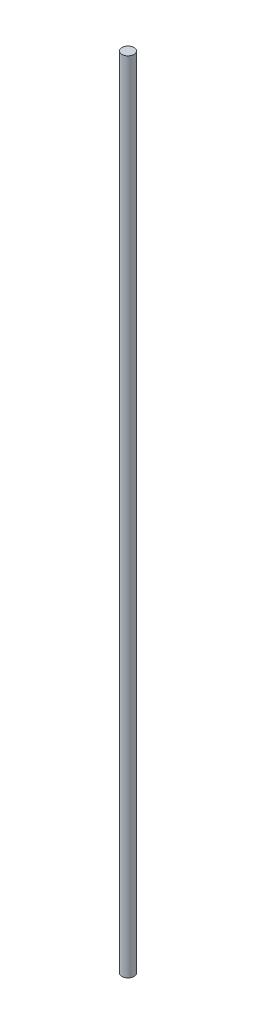
ISO-10303-21;
HEADER;
FILE_DESCRIPTION(('STEP AP214'),'2;1');
FILE_NAME('part.step','',(''),(''),'','','');
FILE_SCHEMA(('AUTOMOTIVE_DESIGN { 1 0 10303 214 1 1 1 1 }'));
ENDSEC;
DATA;
#1=APPLICATION_CONTEXT('core data for automotive mechanical design processes');
#2=APPLICATION_PROTOCOL_DEFINITION('international standard','automotive_design',2000,#1);
#3=PRODUCT_CONTEXT('',#1,'mechanical');
#4=PRODUCT('Part','Part','',(#3));
#5=PRODUCT_RELATED_PRODUCT_CATEGORY('part','',(#4));
#6=PRODUCT_DEFINITION_FORMATION('','',#4);
#7=PRODUCT_DEFINITION_CONTEXT('part definition',#1,'design');
#8=PRODUCT_DEFINITION('design','',#6,#7);
#9=PRODUCT_DEFINITION_SHAPE('','',#8);
#10=(LENGTH_UNIT() NAMED_UNIT(*) SI_UNIT(.MILLI.,.METRE.));
#11=(NAMED_UNIT(*) PLANE_ANGLE_UNIT() SI_UNIT($,.RADIAN.));
#12=(NAMED_UNIT(*) SI_UNIT($,.STERADIAN.) SOLID_ANGLE_UNIT());
#13=UNCERTAINTY_MEASURE_WITH_UNIT(LENGTH_MEASURE(1.E-05),#10,'distance_accuracy_value','');
#14=(GEOMETRIC_REPRESENTATION_CONTEXT(3) GLOBAL_UNCERTAINTY_ASSIGNED_CONTEXT((#13)) GLOBAL_UNIT_ASSIGNED_CONTEXT((#10,
#11,#12)) REPRESENTATION_CONTEXT('',''));
#15=CARTESIAN_POINT('',(0.,0.,0.));
#16=DIRECTION('',(0.,0.,1.));
#17=DIRECTION('',(1.,0.,0.));
#18=AXIS2_PLACEMENT_3D('',#15,#16,#17);
#19=CARTESIAN_POINT('',(0.,0.,0.));
#20=DIRECTION('',(0.,1.,0.));
#21=DIRECTION('',(0.,0.,1.));
#22=AXIS2_PLACEMENT_3D('',#19,#20,#21);
#23=PLANE('',#22);
#24=CARTESIAN_POINT('',(0.,0.,0.));
#25=DIRECTION('',(0.,1.,0.));
#26=DIRECTION('',(0.,0.,1.));
#27=AXIS2_PLACEMENT_3D('',#24,#25,#26);
#28=CIRCLE('',#27,2.5);
#29=CARTESIAN_POINT('',(0.,0.,2.5));
#30=VERTEX_POINT('',#29);
#31=EDGE_CURVE('E38',#30,#30,#28,.T.);
#32=ORIENTED_EDGE('',*,*,#31,.F.);
#33=EDGE_LOOP('',(#32));
#34=FACE_BOUND('',#33,.T.);
#35=ADVANCED_FACE('F31',(#34),#23,.F.);
#36=CARTESIAN_POINT('',(0.,337.771067811865,0.));
#37=DIRECTION('',(0.,-1.,0.));
#38=DIRECTION('',(0.,0.,-1.));
#39=AXIS2_PLACEMENT_3D('',#36,#37,#38);
#40=CYLINDRICAL_SURFACE('',#39,2.5);
#41=CARTESIAN_POINT('',(0.,330.7,0.));
#42=DIRECTION('',(0.,-1.,0.));
#43=DIRECTION('',(1.,0.,0.));
#44=AXIS2_PLACEMENT_3D('',#41,#42,#43);
#45=CIRCLE('',#44,2.5);
#46=CARTESIAN_POINT('',(2.5,330.7,0.));
#47=VERTEX_POINT('',#46);
#48=EDGE_CURVE('E10',#47,#47,#45,.T.);
#49=ORIENTED_EDGE('',*,*,#48,.T.);
#50=EDGE_LOOP('',(#49));
#51=FACE_BOUND('',#50,.T.);
#52=ORIENTED_EDGE('',*,*,#31,.T.);
#53=EDGE_LOOP('',(#52));
#54=FACE_BOUND('',#53,.T.);
#55=ADVANCED_FACE('F33',(#51,#54),#40,.T.);
#56=CARTESIAN_POINT('',(0.,330.7,0.));
#57=DIRECTION('',(0.,-1.,0.));
#58=DIRECTION('',(0.,0.,-1.));
#59=AXIS2_PLACEMENT_3D('',#56,#57,#58);
#60=PLANE('',#59);
#61=ORIENTED_EDGE('',*,*,#48,.F.);
#62=EDGE_LOOP('',(#61));
#63=FACE_BOUND('',#62,.T.);
#64=ADVANCED_FACE('F49',(#63),#60,.F.);
#65=CLOSED_SHELL('',(#35,#55,#64));
#66=MANIFOLD_SOLID_BREP('B2',#65);
#67=ADVANCED_BREP_SHAPE_REPRESENTATION('',(#18,#66),#14);
#68=SHAPE_DEFINITION_REPRESENTATION(#9,#67);
ENDSEC;
END-ISO-10303-21;
